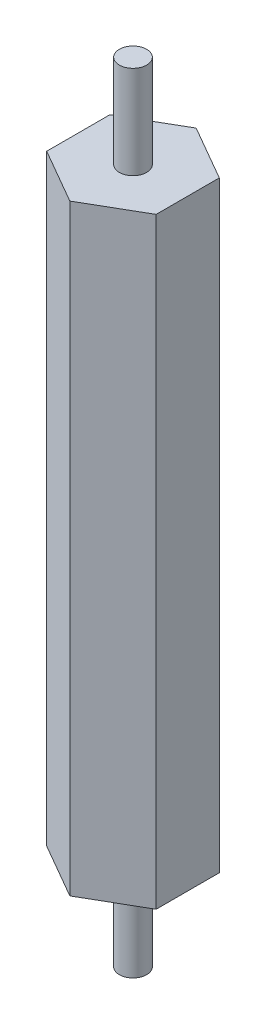
ISO-10303-21;
HEADER;
FILE_DESCRIPTION(('STEP AP214'),'2;1');
FILE_NAME('part.step','',(''),(''),'','','');
FILE_SCHEMA(('AUTOMOTIVE_DESIGN { 1 0 10303 214 1 1 1 1 }'));
ENDSEC;
DATA;
#1=APPLICATION_CONTEXT('core data for automotive mechanical design processes');
#2=APPLICATION_PROTOCOL_DEFINITION('international standard','automotive_design',2000,#1);
#3=PRODUCT_CONTEXT('',#1,'mechanical');
#4=PRODUCT('Part','Part','',(#3));
#5=PRODUCT_RELATED_PRODUCT_CATEGORY('part','',(#4));
#6=PRODUCT_DEFINITION_FORMATION('','',#4);
#7=PRODUCT_DEFINITION_CONTEXT('part definition',#1,'design');
#8=PRODUCT_DEFINITION('design','',#6,#7);
#9=PRODUCT_DEFINITION_SHAPE('','',#8);
#10=(LENGTH_UNIT() NAMED_UNIT(*) SI_UNIT(.MILLI.,.METRE.));
#11=(NAMED_UNIT(*) PLANE_ANGLE_UNIT() SI_UNIT($,.RADIAN.));
#12=(NAMED_UNIT(*) SI_UNIT($,.STERADIAN.) SOLID_ANGLE_UNIT());
#13=UNCERTAINTY_MEASURE_WITH_UNIT(LENGTH_MEASURE(1.E-05),#10,'distance_accuracy_value','');
#14=(GEOMETRIC_REPRESENTATION_CONTEXT(3) GLOBAL_UNCERTAINTY_ASSIGNED_CONTEXT((#13)) GLOBAL_UNIT_ASSIGNED_CONTEXT((#10,
#11,#12)) REPRESENTATION_CONTEXT('',''));
#15=CARTESIAN_POINT('',(0.,0.,0.));
#16=DIRECTION('',(0.,0.,1.));
#17=DIRECTION('',(1.,0.,0.));
#18=AXIS2_PLACEMENT_3D('',#15,#16,#17);
#19=CARTESIAN_POINT('',(0.00370027783764741,110.,11.5470047909091));
#20=DIRECTION('',(-0.500277495165219,0.,-0.865865132587757));
#21=DIRECTION('',(-0.865865132587757,0.,0.500277495165219));
#22=AXIS2_PLACEMENT_3D('',#19,#20,#21);
#23=PLANE('',#22);
#24=DIRECTION('',(0.865865132587757,0.,-0.500277495165219));
#25=VECTOR('',#24,1.);
#26=CARTESIAN_POINT('',(0.00370027783764741,0.,11.5470047909091));
#27=LINE('',#26,#25);
#28=CARTESIAN_POINT('',(0.00370027783764741,0.,11.5470047909091));
#29=VERTEX_POINT('',#28);
#30=CARTESIAN_POINT('',(10.0018496254667,0.,5.77029786084608));
#31=VERTEX_POINT('',#30);
#32=EDGE_CURVE('E131',#29,#31,#27,.T.);
#33=ORIENTED_EDGE('',*,*,#32,.T.);
#34=DIRECTION('',(0.,-1.,0.));
#35=VECTOR('',#34,1.);
#36=CARTESIAN_POINT('',(10.0018496254667,110.,5.77029786084608));
#37=LINE('',#36,#35);
#38=CARTESIAN_POINT('',(10.0018496254667,110.,5.77029786084608));
#39=VERTEX_POINT('',#38);
#40=EDGE_CURVE('E42',#39,#31,#37,.T.);
#41=ORIENTED_EDGE('',*,*,#40,.F.);
#42=DIRECTION('',(0.865865132587757,0.,-0.500277495165219));
#43=VECTOR('',#42,1.);
#44=CARTESIAN_POINT('',(0.00370027783764741,110.,11.5470047909091));
#45=LINE('',#44,#43);
#46=CARTESIAN_POINT('',(0.00370027783764741,110.,11.5470047909091));
#47=VERTEX_POINT('',#46);
#48=EDGE_CURVE('E148',#47,#39,#45,.T.);
#49=ORIENTED_EDGE('',*,*,#48,.F.);
#50=DIRECTION('',(0.,-1.,0.));
#51=VECTOR('',#50,1.);
#52=CARTESIAN_POINT('',(0.00370027783764741,110.,11.5470047909091));
#53=LINE('',#52,#51);
#54=EDGE_CURVE('E127',#47,#29,#53,.T.);
#55=ORIENTED_EDGE('',*,*,#54,.T.);
#56=EDGE_LOOP('',(#33,#41,#49,#55));
#57=FACE_BOUND('',#56,.T.);
#58=ADVANCED_FACE('F39',(#57),#23,.F.);
#59=CARTESIAN_POINT('',(10.0018496254667,110.,5.77029786084608));
#60=DIRECTION('',(-0.999999948654789,0.,0.000320453460847235));
#61=DIRECTION('',(0.000320453460847235,0.,0.999999948654788));
#62=AXIS2_PLACEMENT_3D('',#59,#60,#61);
#63=PLANE('',#62);
#64=DIRECTION('',(-0.000320453460847235,0.,-0.999999948654788));
#65=VECTOR('',#64,1.);
#66=CARTESIAN_POINT('',(10.0018496254667,0.,5.77029786084608));
#67=LINE('',#66,#65);
#68=CARTESIAN_POINT('',(9.99814934762906,0.,-5.77670693006304));
#69=VERTEX_POINT('',#68);
#70=EDGE_CURVE('E135',#31,#69,#67,.T.);
#71=ORIENTED_EDGE('',*,*,#70,.T.);
#72=DIRECTION('',(0.,-1.,0.));
#73=VECTOR('',#72,1.);
#74=CARTESIAN_POINT('',(9.99814934762906,110.,-5.77670693006304));
#75=LINE('',#74,#73);
#76=CARTESIAN_POINT('',(9.99814934762906,110.,-5.77670693006304));
#77=VERTEX_POINT('',#76);
#78=EDGE_CURVE('E154',#77,#69,#75,.T.);
#79=ORIENTED_EDGE('',*,*,#78,.F.);
#80=DIRECTION('',(-0.000320453460847235,0.,-0.999999948654788));
#81=VECTOR('',#80,1.);
#82=CARTESIAN_POINT('',(10.0018496254667,110.,5.77029786084608));
#83=LINE('',#82,#81);
#84=EDGE_CURVE('E96',#39,#77,#83,.T.);
#85=ORIENTED_EDGE('',*,*,#84,.F.);
#86=ORIENTED_EDGE('',*,*,#40,.T.);
#87=EDGE_LOOP('',(#71,#79,#85,#86));
#88=FACE_BOUND('',#87,.T.);
#89=ADVANCED_FACE('F208',(#88),#63,.F.);
#90=CARTESIAN_POINT('',(9.99814934762906,110.,-5.77670693006304));
#91=DIRECTION('',(-0.49972245348957,0.,0.866185586048605));
#92=DIRECTION('',(0.866185586048605,0.,0.49972245348957));
#93=AXIS2_PLACEMENT_3D('',#90,#91,#92);
#94=PLANE('',#93);
#95=DIRECTION('',(-0.866185586048605,0.,-0.49972245348957));
#96=VECTOR('',#95,1.);
#97=CARTESIAN_POINT('',(9.99814934762906,0.,-5.77670693006304));
#98=LINE('',#97,#96);
#99=CARTESIAN_POINT('',(-0.00370027783764419,0.,-11.5470047909091));
#100=VERTEX_POINT('',#99);
#101=EDGE_CURVE('E139',#69,#100,#98,.T.);
#102=ORIENTED_EDGE('',*,*,#101,.T.);
#103=DIRECTION('',(0.,-1.,0.));
#104=VECTOR('',#103,1.);
#105=CARTESIAN_POINT('',(-0.00370027783764419,110.,-11.5470047909091));
#106=LINE('',#105,#104);
#107=CARTESIAN_POINT('',(-0.00370027783764419,110.,-11.5470047909091));
#108=VERTEX_POINT('',#107);
#109=EDGE_CURVE('E120',#108,#100,#106,.T.);
#110=ORIENTED_EDGE('',*,*,#109,.F.);
#111=DIRECTION('',(-0.866185586048605,0.,-0.49972245348957));
#112=VECTOR('',#111,1.);
#113=CARTESIAN_POINT('',(9.99814934762906,110.,-5.77670693006304));
#114=LINE('',#113,#112);
#115=EDGE_CURVE('E109',#77,#108,#114,.T.);
#116=ORIENTED_EDGE('',*,*,#115,.F.);
#117=ORIENTED_EDGE('',*,*,#78,.T.);
#118=EDGE_LOOP('',(#102,#110,#116,#117));
#119=FACE_BOUND('',#118,.T.);
#120=ADVANCED_FACE('F212',(#119),#94,.F.);
#121=CARTESIAN_POINT('',(-0.00370027783764419,110.,-11.5470047909091));
#122=DIRECTION('',(0.500277495165218,0.,0.865865132587758));
#123=DIRECTION('',(0.865865132587758,0.,-0.500277495165218));
#124=AXIS2_PLACEMENT_3D('',#121,#122,#123);
#125=PLANE('',#124);
#126=DIRECTION('',(-0.865865132587758,0.,0.500277495165218));
#127=VECTOR('',#126,1.);
#128=CARTESIAN_POINT('',(-0.00370027783764419,0.,-11.5470047909091));
#129=LINE('',#128,#127);
#130=CARTESIAN_POINT('',(-10.0018496254667,0.,-5.77029786084608));
#131=VERTEX_POINT('',#130);
#132=EDGE_CURVE('E118',#100,#131,#129,.T.);
#133=ORIENTED_EDGE('',*,*,#132,.T.);
#134=DIRECTION('',(0.,-1.,0.));
#135=VECTOR('',#134,1.);
#136=CARTESIAN_POINT('',(-10.0018496254667,110.,-5.77029786084608));
#137=LINE('',#136,#135);
#138=CARTESIAN_POINT('',(-10.0018496254667,110.,-5.77029786084608));
#139=VERTEX_POINT('',#138);
#140=EDGE_CURVE('E115',#139,#131,#137,.T.);
#141=ORIENTED_EDGE('',*,*,#140,.F.);
#142=DIRECTION('',(-0.865865132587758,0.,0.500277495165218));
#143=VECTOR('',#142,1.);
#144=CARTESIAN_POINT('',(-0.00370027783764419,110.,-11.5470047909091));
#145=LINE('',#144,#143);
#146=EDGE_CURVE('E103',#108,#139,#145,.T.);
#147=ORIENTED_EDGE('',*,*,#146,.F.);
#148=ORIENTED_EDGE('',*,*,#109,.T.);
#149=EDGE_LOOP('',(#133,#141,#147,#148));
#150=FACE_BOUND('',#149,.T.);
#151=ADVANCED_FACE('F116',(#150),#125,.F.);
#152=CARTESIAN_POINT('',(-10.0018496254667,110.,-5.77029786084608));
#153=DIRECTION('',(0.999999948654788,0.,-0.000320453460846935));
#154=DIRECTION('',(-0.000320453460846935,0.,-0.999999948654788));
#155=AXIS2_PLACEMENT_3D('',#152,#153,#154);
#156=PLANE('',#155);
#157=DIRECTION('',(0.000320453460846935,0.,0.999999948654788));
#158=VECTOR('',#157,1.);
#159=CARTESIAN_POINT('',(-10.0018496254667,0.,-5.77029786084608));
#160=LINE('',#159,#158);
#161=CARTESIAN_POINT('',(-9.99814934762908,0.,5.77670693006302));
#162=VERTEX_POINT('',#161);
#163=EDGE_CURVE('E81',#131,#162,#160,.T.);
#164=ORIENTED_EDGE('',*,*,#163,.T.);
#165=DIRECTION('',(0.,-1.,0.));
#166=VECTOR('',#165,1.);
#167=CARTESIAN_POINT('',(-9.99814934762908,110.,5.77670693006302));
#168=LINE('',#167,#166);
#169=CARTESIAN_POINT('',(-9.99814934762908,110.,5.77670693006302));
#170=VERTEX_POINT('',#169);
#171=EDGE_CURVE('E121',#170,#162,#168,.T.);
#172=ORIENTED_EDGE('',*,*,#171,.F.);
#173=DIRECTION('',(0.000320453460846935,0.,0.999999948654788));
#174=VECTOR('',#173,1.);
#175=CARTESIAN_POINT('',(-10.0018496254667,110.,-5.77029786084608));
#176=LINE('',#175,#174);
#177=EDGE_CURVE('E107',#139,#170,#176,.T.);
#178=ORIENTED_EDGE('',*,*,#177,.F.);
#179=ORIENTED_EDGE('',*,*,#140,.T.);
#180=EDGE_LOOP('',(#164,#172,#178,#179));
#181=FACE_BOUND('',#180,.T.);
#182=ADVANCED_FACE('F123',(#181),#156,.F.);
#183=CARTESIAN_POINT('',(-9.99814934762908,110.,5.77670693006302));
#184=DIRECTION('',(0.49972245348957,0.,-0.866185586048605));
#185=DIRECTION('',(-0.866185586048605,0.,-0.49972245348957));
#186=AXIS2_PLACEMENT_3D('',#183,#184,#185);
#187=PLANE('',#186);
#188=DIRECTION('',(0.866185586048604,0.,0.49972245348957));
#189=VECTOR('',#188,1.);
#190=CARTESIAN_POINT('',(-9.99814934762908,0.,5.77670693006302));
#191=LINE('',#190,#189);
#192=EDGE_CURVE('E87',#162,#29,#191,.T.);
#193=ORIENTED_EDGE('',*,*,#192,.T.);
#194=ORIENTED_EDGE('',*,*,#54,.F.);
#195=DIRECTION('',(0.866185586048604,0.,0.49972245348957));
#196=VECTOR('',#195,1.);
#197=CARTESIAN_POINT('',(-9.99814934762908,110.,5.77670693006302));
#198=LINE('',#197,#196);
#199=EDGE_CURVE('E58',#170,#47,#198,.T.);
#200=ORIENTED_EDGE('',*,*,#199,.F.);
#201=ORIENTED_EDGE('',*,*,#171,.T.);
#202=EDGE_LOOP('',(#193,#194,#200,#201));
#203=FACE_BOUND('',#202,.T.);
#204=ADVANCED_FACE('F197',(#203),#187,.F.);
#205=CARTESIAN_POINT('',(0.,110.,0.));
#206=DIRECTION('',(0.,1.,0.));
#207=DIRECTION('',(0.,0.,1.));
#208=AXIS2_PLACEMENT_3D('',#205,#206,#207);
#209=PLANE('',#208);
#210=CARTESIAN_POINT('',(0.,110.,0.));
#211=DIRECTION('',(0.,1.,0.));
#212=DIRECTION('',(0.,0.,1.));
#213=AXIS2_PLACEMENT_3D('',#210,#211,#212);
#214=CIRCLE('',#213,2.5);
#215=CARTESIAN_POINT('',(0.,110.,2.5));
#216=VERTEX_POINT('',#215);
#217=EDGE_CURVE('E49',#216,#216,#214,.T.);
#218=ORIENTED_EDGE('',*,*,#217,.F.);
#219=EDGE_LOOP('',(#218));
#220=FACE_BOUND('',#219,.T.);
#221=ORIENTED_EDGE('',*,*,#48,.T.);
#222=ORIENTED_EDGE('',*,*,#84,.T.);
#223=ORIENTED_EDGE('',*,*,#115,.T.);
#224=ORIENTED_EDGE('',*,*,#146,.T.);
#225=ORIENTED_EDGE('',*,*,#177,.T.);
#226=ORIENTED_EDGE('',*,*,#199,.T.);
#227=EDGE_LOOP('',(#221,#222,#223,#224,#225,#226));
#228=FACE_BOUND('',#227,.T.);
#229=ADVANCED_FACE('F105',(#220,#228),#209,.T.);
#230=CARTESIAN_POINT('',(0.,0.,0.));
#231=DIRECTION('',(0.,1.,0.));
#232=DIRECTION('',(0.,0.,1.));
#233=AXIS2_PLACEMENT_3D('',#230,#231,#232);
#234=PLANE('',#233);
#235=CARTESIAN_POINT('',(0.,0.,0.));
#236=DIRECTION('',(0.,-1.,0.));
#237=DIRECTION('',(0.,0.,-1.));
#238=AXIS2_PLACEMENT_3D('',#235,#236,#237);
#239=CIRCLE('',#238,2.5);
#240=CARTESIAN_POINT('',(0.,0.,-2.5));
#241=VERTEX_POINT('',#240);
#242=EDGE_CURVE('E11',#241,#241,#239,.T.);
#243=ORIENTED_EDGE('',*,*,#242,.F.);
#244=EDGE_LOOP('',(#243));
#245=FACE_BOUND('',#244,.T.);
#246=ORIENTED_EDGE('',*,*,#32,.F.);
#247=ORIENTED_EDGE('',*,*,#192,.F.);
#248=ORIENTED_EDGE('',*,*,#163,.F.);
#249=ORIENTED_EDGE('',*,*,#132,.F.);
#250=ORIENTED_EDGE('',*,*,#101,.F.);
#251=ORIENTED_EDGE('',*,*,#70,.F.);
#252=EDGE_LOOP('',(#246,#247,#248,#249,#250,#251));
#253=FACE_BOUND('',#252,.T.);
#254=ADVANCED_FACE('F189',(#245,#253),#234,.F.);
#255=CARTESIAN_POINT('',(0.,127.,0.));
#256=DIRECTION('',(0.,-1.,0.));
#257=DIRECTION('',(0.,0.,-1.));
#258=AXIS2_PLACEMENT_3D('',#255,#256,#257);
#259=CYLINDRICAL_SURFACE('',#258,2.5);
#260=CARTESIAN_POINT('',(0.,127.,0.));
#261=DIRECTION('',(0.,1.,0.));
#262=DIRECTION('',(0.,0.,1.));
#263=AXIS2_PLACEMENT_3D('',#260,#261,#262);
#264=CIRCLE('',#263,2.5);
#265=CARTESIAN_POINT('',(0.,127.,2.5));
#266=VERTEX_POINT('',#265);
#267=EDGE_CURVE('E136',#266,#266,#264,.T.);
#268=ORIENTED_EDGE('',*,*,#267,.F.);
#269=EDGE_LOOP('',(#268));
#270=FACE_BOUND('',#269,.T.);
#271=ORIENTED_EDGE('',*,*,#217,.T.);
#272=EDGE_LOOP('',(#271));
#273=FACE_BOUND('',#272,.T.);
#274=ADVANCED_FACE('F192',(#270,#273),#259,.T.);
#275=CARTESIAN_POINT('',(0.,127.,0.));
#276=DIRECTION('',(0.,1.,0.));
#277=DIRECTION('',(0.,0.,1.));
#278=AXIS2_PLACEMENT_3D('',#275,#276,#277);
#279=PLANE('',#278);
#280=ORIENTED_EDGE('',*,*,#267,.T.);
#281=EDGE_LOOP('',(#280));
#282=FACE_BOUND('',#281,.T.);
#283=ADVANCED_FACE('F185',(#282),#279,.T.);
#284=CARTESIAN_POINT('',(0.,-17.,0.));
#285=DIRECTION('',(0.,1.,0.));
#286=DIRECTION('',(0.,0.,1.));
#287=AXIS2_PLACEMENT_3D('',#284,#285,#286);
#288=CYLINDRICAL_SURFACE('',#287,2.5);
#289=CARTESIAN_POINT('',(0.,-17.,0.));
#290=DIRECTION('',(0.,-1.,0.));
#291=DIRECTION('',(0.,0.,-1.));
#292=AXIS2_PLACEMENT_3D('',#289,#290,#291);
#293=CIRCLE('',#292,2.5);
#294=CARTESIAN_POINT('',(0.,-17.,-2.5));
#295=VERTEX_POINT('',#294);
#296=EDGE_CURVE('E175',#295,#295,#293,.T.);
#297=ORIENTED_EDGE('',*,*,#296,.F.);
#298=EDGE_LOOP('',(#297));
#299=FACE_BOUND('',#298,.T.);
#300=ORIENTED_EDGE('',*,*,#242,.T.);
#301=EDGE_LOOP('',(#300));
#302=FACE_BOUND('',#301,.T.);
#303=ADVANCED_FACE('F182',(#299,#302),#288,.T.);
#304=CARTESIAN_POINT('',(0.,-17.,0.));
#305=DIRECTION('',(0.,-1.,0.));
#306=DIRECTION('',(0.,0.,-1.));
#307=AXIS2_PLACEMENT_3D('',#304,#305,#306);
#308=PLANE('',#307);
#309=ORIENTED_EDGE('',*,*,#296,.T.);
#310=EDGE_LOOP('',(#309));
#311=FACE_BOUND('',#310,.T.);
#312=ADVANCED_FACE('F180',(#311),#308,.T.);
#313=CLOSED_SHELL('',(#58,#89,#120,#151,#182,#204,#229,#254,#274,#283,#303,#312));
#314=MANIFOLD_SOLID_BREP('B2',#313);
#315=ADVANCED_BREP_SHAPE_REPRESENTATION('',(#18,#314),#14);
#316=SHAPE_DEFINITION_REPRESENTATION(#9,#315);
ENDSEC;
END-ISO-10303-21;
